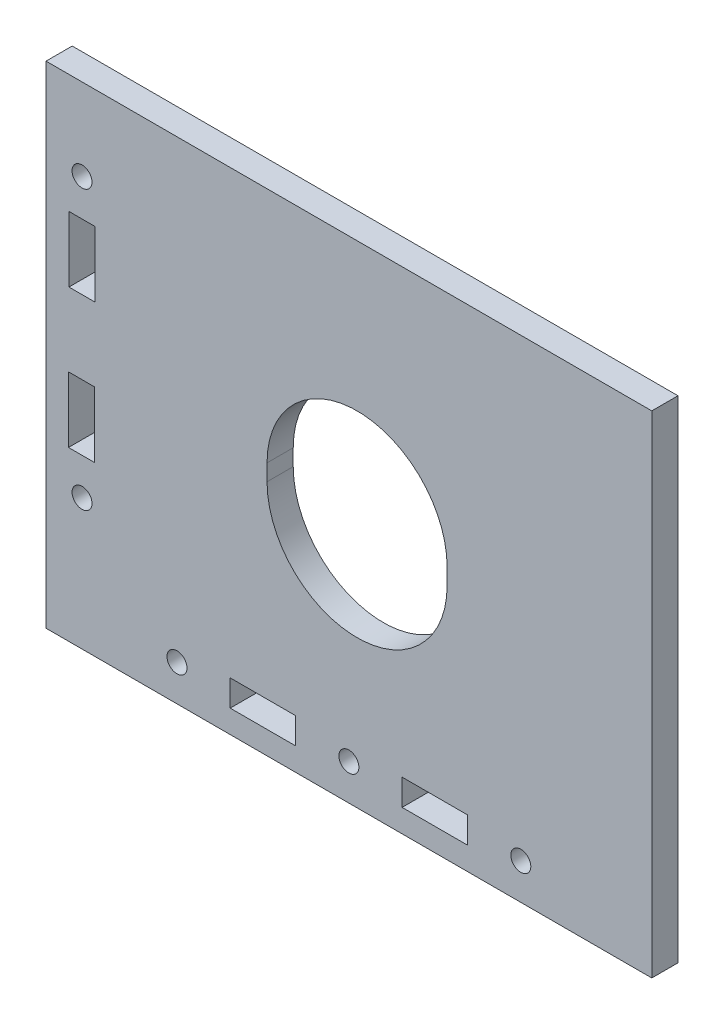
ISO-10303-21;
HEADER;
FILE_DESCRIPTION(('STEP AP214'),'2;1');
FILE_NAME('part.step','',(''),(''),'','','');
FILE_SCHEMA(('AUTOMOTIVE_DESIGN { 1 0 10303 214 1 1 1 1 }'));
ENDSEC;
DATA;
#1=APPLICATION_CONTEXT('core data for automotive mechanical design processes');
#2=APPLICATION_PROTOCOL_DEFINITION('international standard','automotive_design',2000,#1);
#3=PRODUCT_CONTEXT('',#1,'mechanical');
#4=PRODUCT('Part','Part','',(#3));
#5=PRODUCT_RELATED_PRODUCT_CATEGORY('part','',(#4));
#6=PRODUCT_DEFINITION_FORMATION('','',#4);
#7=PRODUCT_DEFINITION_CONTEXT('part definition',#1,'design');
#8=PRODUCT_DEFINITION('design','',#6,#7);
#9=PRODUCT_DEFINITION_SHAPE('','',#8);
#10=(LENGTH_UNIT() NAMED_UNIT(*) SI_UNIT(.MILLI.,.METRE.));
#11=(NAMED_UNIT(*) PLANE_ANGLE_UNIT() SI_UNIT($,.RADIAN.));
#12=(NAMED_UNIT(*) SI_UNIT($,.STERADIAN.) SOLID_ANGLE_UNIT());
#13=UNCERTAINTY_MEASURE_WITH_UNIT(LENGTH_MEASURE(1.E-05),#10,'distance_accuracy_value','');
#14=(GEOMETRIC_REPRESENTATION_CONTEXT(3) GLOBAL_UNCERTAINTY_ASSIGNED_CONTEXT((#13)) GLOBAL_UNIT_ASSIGNED_CONTEXT((#10,
#11,#12)) REPRESENTATION_CONTEXT('',''));
#15=CARTESIAN_POINT('',(0.,0.,0.));
#16=DIRECTION('',(0.,0.,1.));
#17=DIRECTION('',(1.,0.,0.));
#18=AXIS2_PLACEMENT_3D('',#15,#16,#17);
#19=CARTESIAN_POINT('',(0.,0.,8.));
#20=DIRECTION('',(0.,0.,-1.));
#21=DIRECTION('',(-1.,0.,0.));
#22=AXIS2_PLACEMENT_3D('',#19,#20,#21);
#23=PLANE('',#22);
#24=DIRECTION('',(1.,0.,0.));
#25=VECTOR('',#24,1.);
#26=CARTESIAN_POINT('',(0.,78.75,8.));
#27=LINE('',#26,#25);
#28=CARTESIAN_POINT('',(-8.,78.75,8.));
#29=VERTEX_POINT('',#28);
#30=CARTESIAN_POINT('',(0.,78.75,8.));
#31=VERTEX_POINT('',#30);
#32=EDGE_CURVE('E230',#29,#31,#27,.T.);
#33=ORIENTED_EDGE('',*,*,#32,.F.);
#34=DIRECTION('',(0.,-1.,0.));
#35=VECTOR('',#34,1.);
#36=CARTESIAN_POINT('',(-8.,78.75,8.));
#37=LINE('',#36,#35);
#38=CARTESIAN_POINT('',(-8.,98.75,8.));
#39=VERTEX_POINT('',#38);
#40=EDGE_CURVE('E238',#39,#29,#37,.T.);
#41=ORIENTED_EDGE('',*,*,#40,.F.);
#42=DIRECTION('',(-1.,0.,0.));
#43=VECTOR('',#42,1.);
#44=CARTESIAN_POINT('',(-8.,98.75,8.));
#45=LINE('',#44,#43);
#46=CARTESIAN_POINT('',(0.,98.75,8.));
#47=VERTEX_POINT('',#46);
#48=EDGE_CURVE('E235',#47,#39,#45,.T.);
#49=ORIENTED_EDGE('',*,*,#48,.F.);
#50=DIRECTION('',(0.,1.,0.));
#51=VECTOR('',#50,1.);
#52=CARTESIAN_POINT('',(0.,98.75,8.));
#53=LINE('',#52,#51);
#54=EDGE_CURVE('E232',#31,#47,#53,.T.);
#55=ORIENTED_EDGE('',*,*,#54,.F.);
#56=EDGE_LOOP('',(#33,#41,#49,#55));
#57=FACE_BOUND('',#56,.T.);
#58=DIRECTION('',(1.,0.,0.));
#59=VECTOR('',#58,1.);
#60=CARTESIAN_POINT('',(113.75,-8.,8.));
#61=LINE('',#60,#59);
#62=CARTESIAN_POINT('',(93.75,-8.,8.));
#63=VERTEX_POINT('',#62);
#64=CARTESIAN_POINT('',(113.75,-8.,8.));
#65=VERTEX_POINT('',#64);
#66=EDGE_CURVE('E292',#63,#65,#61,.T.);
#67=ORIENTED_EDGE('',*,*,#66,.F.);
#68=DIRECTION('',(0.,-1.,0.));
#69=VECTOR('',#68,1.);
#70=CARTESIAN_POINT('',(93.75,-8.,8.));
#71=LINE('',#70,#69);
#72=CARTESIAN_POINT('',(93.75,0.,8.));
#73=VERTEX_POINT('',#72);
#74=EDGE_CURVE('E300',#73,#63,#71,.T.);
#75=ORIENTED_EDGE('',*,*,#74,.F.);
#76=DIRECTION('',(-1.,0.,0.));
#77=VECTOR('',#76,1.);
#78=CARTESIAN_POINT('',(93.75,0.,8.));
#79=LINE('',#78,#77);
#80=CARTESIAN_POINT('',(113.75,0.,8.));
#81=VERTEX_POINT('',#80);
#82=EDGE_CURVE('E297',#81,#73,#79,.T.);
#83=ORIENTED_EDGE('',*,*,#82,.F.);
#84=DIRECTION('',(0.,1.,0.));
#85=VECTOR('',#84,1.);
#86=CARTESIAN_POINT('',(113.75,0.,8.));
#87=LINE('',#86,#85);
#88=EDGE_CURVE('E294',#65,#81,#87,.T.);
#89=ORIENTED_EDGE('',*,*,#88,.F.);
#90=EDGE_LOOP('',(#67,#75,#83,#89));
#91=FACE_BOUND('',#90,.T.);
#92=CARTESIAN_POINT('',(-4.,110.,8.));
#93=DIRECTION('',(0.,0.,1.));
#94=DIRECTION('',(1.,0.,0.));
#95=AXIS2_PLACEMENT_3D('',#92,#93,#94);
#96=CIRCLE('',#95,3.05);
#97=CARTESIAN_POINT('',(-0.95,110.,8.));
#98=VERTEX_POINT('',#97);
#99=EDGE_CURVE('E329',#98,#98,#96,.T.);
#100=ORIENTED_EDGE('',*,*,#99,.F.);
#101=EDGE_LOOP('',(#100));
#102=FACE_BOUND('',#101,.T.);
#103=CARTESIAN_POINT('',(25.,-4.,8.));
#104=DIRECTION('',(0.,0.,1.));
#105=DIRECTION('',(1.,0.,0.));
#106=AXIS2_PLACEMENT_3D('',#103,#104,#105);
#107=CIRCLE('',#106,3.05);
#108=CARTESIAN_POINT('',(28.05,-4.,8.));
#109=VERTEX_POINT('',#108);
#110=EDGE_CURVE('E341',#109,#109,#107,.T.);
#111=ORIENTED_EDGE('',*,*,#110,.F.);
#112=EDGE_LOOP('',(#111));
#113=FACE_BOUND('',#112,.T.);
#114=CARTESIAN_POINT('',(80.,62.5,8.));
#115=DIRECTION('',(0.,0.,1.));
#116=DIRECTION('',(1.,0.,0.));
#117=AXIS2_PLACEMENT_3D('',#114,#115,#116);
#118=CIRCLE('',#117,27.5);
#119=CARTESIAN_POINT('',(107.5,62.5,8.));
#120=VERTEX_POINT('',#119);
#121=CARTESIAN_POINT('',(52.5,62.5,8.));
#122=VERTEX_POINT('',#121);
#123=EDGE_CURVE('E353',#120,#122,#118,.T.);
#124=ORIENTED_EDGE('',*,*,#123,.F.);
#125=DIRECTION('',(0.,1.,0.));
#126=VECTOR('',#125,1.);
#127=CARTESIAN_POINT('',(107.5,62.5,8.));
#128=LINE('',#127,#126);
#129=CARTESIAN_POINT('',(107.5,57.5,8.));
#130=VERTEX_POINT('',#129);
#131=EDGE_CURVE('E361',#130,#120,#128,.T.);
#132=ORIENTED_EDGE('',*,*,#131,.F.);
#133=CARTESIAN_POINT('',(80.,57.5,8.));
#134=DIRECTION('',(0.,0.,1.));
#135=DIRECTION('',(1.,0.,0.));
#136=AXIS2_PLACEMENT_3D('',#133,#134,#135);
#137=CIRCLE('',#136,27.5);
#138=CARTESIAN_POINT('',(52.5,57.5,8.));
#139=VERTEX_POINT('',#138);
#140=EDGE_CURVE('E358',#139,#130,#137,.T.);
#141=ORIENTED_EDGE('',*,*,#140,.F.);
#142=DIRECTION('',(0.,-1.,0.));
#143=VECTOR('',#142,1.);
#144=CARTESIAN_POINT('',(52.5,57.5,8.));
#145=LINE('',#144,#143);
#146=EDGE_CURVE('E355',#122,#139,#145,.T.);
#147=ORIENTED_EDGE('',*,*,#146,.F.);
#148=EDGE_LOOP('',(#124,#132,#141,#147));
#149=FACE_BOUND('',#148,.T.);
#150=DIRECTION('',(1.,0.,0.));
#151=VECTOR('',#150,1.);
#152=CARTESIAN_POINT('',(170.,-15.,8.));
#153=LINE('',#152,#151);
#154=CARTESIAN_POINT('',(-15.,-15.,8.));
#155=VERTEX_POINT('',#154);
#156=CARTESIAN_POINT('',(170.,-15.,8.));
#157=VERTEX_POINT('',#156);
#158=EDGE_CURVE('E384',#155,#157,#153,.T.);
#159=ORIENTED_EDGE('',*,*,#158,.T.);
#160=DIRECTION('',(0.,1.,0.));
#161=VECTOR('',#160,1.);
#162=CARTESIAN_POINT('',(170.,-15.,8.));
#163=LINE('',#162,#161);
#164=CARTESIAN_POINT('',(170.,135.,8.));
#165=VERTEX_POINT('',#164);
#166=EDGE_CURVE('E387',#157,#165,#163,.T.);
#167=ORIENTED_EDGE('',*,*,#166,.T.);
#168=DIRECTION('',(-1.,0.,0.));
#169=VECTOR('',#168,1.);
#170=CARTESIAN_POINT('',(170.,135.,8.));
#171=LINE('',#170,#169);
#172=CARTESIAN_POINT('',(-15.,135.,8.));
#173=VERTEX_POINT('',#172);
#174=EDGE_CURVE('E390',#165,#173,#171,.T.);
#175=ORIENTED_EDGE('',*,*,#174,.T.);
#176=DIRECTION('',(0.,-1.,0.));
#177=VECTOR('',#176,1.);
#178=CARTESIAN_POINT('',(-15.,-15.,8.));
#179=LINE('',#178,#177);
#180=EDGE_CURVE('E392',#173,#155,#179,.T.);
#181=ORIENTED_EDGE('',*,*,#180,.T.);
#182=EDGE_LOOP('',(#159,#167,#175,#181));
#183=FACE_BOUND('',#182,.T.);
#184=CARTESIAN_POINT('',(130.,-4.,8.));
#185=DIRECTION('',(0.,0.,1.));
#186=DIRECTION('',(1.,0.,0.));
#187=AXIS2_PLACEMENT_3D('',#184,#185,#186);
#188=CIRCLE('',#187,3.05);
#189=CARTESIAN_POINT('',(133.05,-4.,8.));
#190=VERTEX_POINT('',#189);
#191=EDGE_CURVE('E347',#190,#190,#188,.T.);
#192=ORIENTED_EDGE('',*,*,#191,.F.);
#193=EDGE_LOOP('',(#192));
#194=FACE_BOUND('',#193,.T.);
#195=CARTESIAN_POINT('',(-4.,25.,8.));
#196=DIRECTION('',(0.,0.,1.));
#197=DIRECTION('',(1.,0.,0.));
#198=AXIS2_PLACEMENT_3D('',#195,#196,#197);
#199=CIRCLE('',#198,3.05);
#200=CARTESIAN_POINT('',(-0.95,25.,8.));
#201=VERTEX_POINT('',#200);
#202=EDGE_CURVE('E335',#201,#201,#199,.T.);
#203=ORIENTED_EDGE('',*,*,#202,.F.);
#204=EDGE_LOOP('',(#203));
#205=FACE_BOUND('',#204,.T.);
#206=CARTESIAN_POINT('',(77.5,-4.,8.));
#207=DIRECTION('',(0.,0.,1.));
#208=DIRECTION('',(1.,0.,0.));
#209=AXIS2_PLACEMENT_3D('',#206,#207,#208);
#210=CIRCLE('',#209,3.05000000000001);
#211=CARTESIAN_POINT('',(80.55,-4.,8.));
#212=VERTEX_POINT('',#211);
#213=EDGE_CURVE('E323',#212,#212,#210,.T.);
#214=ORIENTED_EDGE('',*,*,#213,.F.);
#215=EDGE_LOOP('',(#214));
#216=FACE_BOUND('',#215,.T.);
#217=DIRECTION('',(1.,0.,0.));
#218=VECTOR('',#217,1.);
#219=CARTESIAN_POINT('',(61.25,-8.,8.));
#220=LINE('',#219,#218);
#221=CARTESIAN_POINT('',(41.25,-8.,8.));
#222=VERTEX_POINT('',#221);
#223=CARTESIAN_POINT('',(61.25,-8.,8.));
#224=VERTEX_POINT('',#223);
#225=EDGE_CURVE('E261',#222,#224,#220,.T.);
#226=ORIENTED_EDGE('',*,*,#225,.F.);
#227=DIRECTION('',(0.,-1.,0.));
#228=VECTOR('',#227,1.);
#229=CARTESIAN_POINT('',(41.25,-8.,8.));
#230=LINE('',#229,#228);
#231=CARTESIAN_POINT('',(41.25,0.,8.));
#232=VERTEX_POINT('',#231);
#233=EDGE_CURVE('E269',#232,#222,#230,.T.);
#234=ORIENTED_EDGE('',*,*,#233,.F.);
#235=DIRECTION('',(-1.,0.,0.));
#236=VECTOR('',#235,1.);
#237=CARTESIAN_POINT('',(41.25,0.,8.));
#238=LINE('',#237,#236);
#239=CARTESIAN_POINT('',(61.25,0.,8.));
#240=VERTEX_POINT('',#239);
#241=EDGE_CURVE('E266',#240,#232,#238,.T.);
#242=ORIENTED_EDGE('',*,*,#241,.F.);
#243=DIRECTION('',(0.,1.,0.));
#244=VECTOR('',#243,1.);
#245=CARTESIAN_POINT('',(61.25,0.,8.));
#246=LINE('',#245,#244);
#247=EDGE_CURVE('E263',#224,#240,#246,.T.);
#248=ORIENTED_EDGE('',*,*,#247,.F.);
#249=EDGE_LOOP('',(#226,#234,#242,#248));
#250=FACE_BOUND('',#249,.T.);
#251=DIRECTION('',(1.,0.,0.));
#252=VECTOR('',#251,1.);
#253=CARTESIAN_POINT('',(-0.13466,36.25,8.));
#254=LINE('',#253,#252);
#255=CARTESIAN_POINT('',(-8.13466,36.25,8.));
#256=VERTEX_POINT('',#255);
#257=CARTESIAN_POINT('',(-0.13466,36.25,8.));
#258=VERTEX_POINT('',#257);
#259=EDGE_CURVE('E194',#256,#258,#254,.T.);
#260=ORIENTED_EDGE('',*,*,#259,.F.);
#261=DIRECTION('',(0.,-1.,0.));
#262=VECTOR('',#261,1.);
#263=CARTESIAN_POINT('',(-8.13466,36.25,8.));
#264=LINE('',#263,#262);
#265=CARTESIAN_POINT('',(-8.13466,56.25,8.));
#266=VERTEX_POINT('',#265);
#267=EDGE_CURVE('E216',#266,#256,#264,.T.);
#268=ORIENTED_EDGE('',*,*,#267,.F.);
#269=DIRECTION('',(-1.,0.,0.));
#270=VECTOR('',#269,1.);
#271=CARTESIAN_POINT('',(-8.13466,56.25,8.));
#272=LINE('',#271,#270);
#273=CARTESIAN_POINT('',(-0.13466,56.25,8.));
#274=VERTEX_POINT('',#273);
#275=EDGE_CURVE('E214',#274,#266,#272,.T.);
#276=ORIENTED_EDGE('',*,*,#275,.F.);
#277=DIRECTION('',(0.,1.,0.));
#278=VECTOR('',#277,1.);
#279=CARTESIAN_POINT('',(-0.13466,56.25,8.));
#280=LINE('',#279,#278);
#281=EDGE_CURVE('E202',#258,#274,#280,.T.);
#282=ORIENTED_EDGE('',*,*,#281,.F.);
#283=EDGE_LOOP('',(#260,#268,#276,#282));
#284=FACE_BOUND('',#283,.T.);
#285=ADVANCED_FACE('F33',(#57,#91,#102,#113,#149,#183,#194,#205,#216,#250,#284),#23,.F.);
#286=CARTESIAN_POINT('',(0.,0.,0.));
#287=DIRECTION('',(0.,0.,-1.));
#288=DIRECTION('',(-1.,0.,0.));
#289=AXIS2_PLACEMENT_3D('',#286,#287,#288);
#290=PLANE('',#289);
#291=DIRECTION('',(0.,-1.,0.));
#292=VECTOR('',#291,1.);
#293=CARTESIAN_POINT('',(-8.,78.75,0.));
#294=LINE('',#293,#292);
#295=CARTESIAN_POINT('',(-8.,98.75,0.));
#296=VERTEX_POINT('',#295);
#297=CARTESIAN_POINT('',(-8.,78.75,0.));
#298=VERTEX_POINT('',#297);
#299=EDGE_CURVE('E233',#296,#298,#294,.T.);
#300=ORIENTED_EDGE('',*,*,#299,.T.);
#301=DIRECTION('',(1.,0.,0.));
#302=VECTOR('',#301,1.);
#303=CARTESIAN_POINT('',(0.,78.75,0.));
#304=LINE('',#303,#302);
#305=CARTESIAN_POINT('',(0.,78.75,0.));
#306=VERTEX_POINT('',#305);
#307=EDGE_CURVE('E210',#298,#306,#304,.T.);
#308=ORIENTED_EDGE('',*,*,#307,.T.);
#309=DIRECTION('',(0.,1.,0.));
#310=VECTOR('',#309,1.);
#311=CARTESIAN_POINT('',(0.,98.75,0.));
#312=LINE('',#311,#310);
#313=CARTESIAN_POINT('',(0.,98.75,0.));
#314=VERTEX_POINT('',#313);
#315=EDGE_CURVE('E243',#306,#314,#312,.T.);
#316=ORIENTED_EDGE('',*,*,#315,.T.);
#317=DIRECTION('',(-1.,0.,0.));
#318=VECTOR('',#317,1.);
#319=CARTESIAN_POINT('',(-8.,98.75,0.));
#320=LINE('',#319,#318);
#321=EDGE_CURVE('E246',#314,#296,#320,.T.);
#322=ORIENTED_EDGE('',*,*,#321,.T.);
#323=EDGE_LOOP('',(#300,#308,#316,#322));
#324=FACE_BOUND('',#323,.T.);
#325=DIRECTION('',(0.,-1.,0.));
#326=VECTOR('',#325,1.);
#327=CARTESIAN_POINT('',(93.75,-8.,0.));
#328=LINE('',#327,#326);
#329=CARTESIAN_POINT('',(93.75,0.,0.));
#330=VERTEX_POINT('',#329);
#331=CARTESIAN_POINT('',(93.75,-8.,0.));
#332=VERTEX_POINT('',#331);
#333=EDGE_CURVE('E295',#330,#332,#328,.T.);
#334=ORIENTED_EDGE('',*,*,#333,.T.);
#335=DIRECTION('',(1.,0.,0.));
#336=VECTOR('',#335,1.);
#337=CARTESIAN_POINT('',(113.75,-8.,0.));
#338=LINE('',#337,#336);
#339=CARTESIAN_POINT('',(113.75,-8.,0.));
#340=VERTEX_POINT('',#339);
#341=EDGE_CURVE('E291',#332,#340,#338,.T.);
#342=ORIENTED_EDGE('',*,*,#341,.T.);
#343=DIRECTION('',(0.,1.,0.));
#344=VECTOR('',#343,1.);
#345=CARTESIAN_POINT('',(113.75,0.,0.));
#346=LINE('',#345,#344);
#347=CARTESIAN_POINT('',(113.75,0.,0.));
#348=VERTEX_POINT('',#347);
#349=EDGE_CURVE('E305',#340,#348,#346,.T.);
#350=ORIENTED_EDGE('',*,*,#349,.T.);
#351=DIRECTION('',(-1.,0.,0.));
#352=VECTOR('',#351,1.);
#353=CARTESIAN_POINT('',(93.75,0.,0.));
#354=LINE('',#353,#352);
#355=EDGE_CURVE('E308',#348,#330,#354,.T.);
#356=ORIENTED_EDGE('',*,*,#355,.T.);
#357=EDGE_LOOP('',(#334,#342,#350,#356));
#358=FACE_BOUND('',#357,.T.);
#359=CARTESIAN_POINT('',(-4.,110.,0.));
#360=DIRECTION('',(0.,0.,1.));
#361=DIRECTION('',(1.,0.,0.));
#362=AXIS2_PLACEMENT_3D('',#359,#360,#361);
#363=CIRCLE('',#362,3.05);
#364=CARTESIAN_POINT('',(-0.95,110.,0.));
#365=VERTEX_POINT('',#364);
#366=EDGE_CURVE('E326',#365,#365,#363,.T.);
#367=ORIENTED_EDGE('',*,*,#366,.T.);
#368=EDGE_LOOP('',(#367));
#369=FACE_BOUND('',#368,.T.);
#370=CARTESIAN_POINT('',(25.,-4.,0.));
#371=DIRECTION('',(0.,0.,1.));
#372=DIRECTION('',(1.,0.,0.));
#373=AXIS2_PLACEMENT_3D('',#370,#371,#372);
#374=CIRCLE('',#373,3.05);
#375=CARTESIAN_POINT('',(28.05,-4.,0.));
#376=VERTEX_POINT('',#375);
#377=EDGE_CURVE('E338',#376,#376,#374,.T.);
#378=ORIENTED_EDGE('',*,*,#377,.T.);
#379=EDGE_LOOP('',(#378));
#380=FACE_BOUND('',#379,.T.);
#381=DIRECTION('',(0.,1.,0.));
#382=VECTOR('',#381,1.);
#383=CARTESIAN_POINT('',(107.5,62.5,0.));
#384=LINE('',#383,#382);
#385=CARTESIAN_POINT('',(107.5,57.5,0.));
#386=VERTEX_POINT('',#385);
#387=CARTESIAN_POINT('',(107.5,62.5,0.));
#388=VERTEX_POINT('',#387);
#389=EDGE_CURVE('E356',#386,#388,#384,.T.);
#390=ORIENTED_EDGE('',*,*,#389,.T.);
#391=CARTESIAN_POINT('',(80.,62.5,0.));
#392=DIRECTION('',(0.,0.,1.));
#393=DIRECTION('',(1.,0.,0.));
#394=AXIS2_PLACEMENT_3D('',#391,#392,#393);
#395=CIRCLE('',#394,27.5);
#396=CARTESIAN_POINT('',(52.5,62.5,0.));
#397=VERTEX_POINT('',#396);
#398=EDGE_CURVE('E350',#388,#397,#395,.T.);
#399=ORIENTED_EDGE('',*,*,#398,.T.);
#400=DIRECTION('',(0.,-1.,0.));
#401=VECTOR('',#400,1.);
#402=CARTESIAN_POINT('',(52.5,57.5,0.));
#403=LINE('',#402,#401);
#404=CARTESIAN_POINT('',(52.5,57.5,0.));
#405=VERTEX_POINT('',#404);
#406=EDGE_CURVE('E366',#397,#405,#403,.T.);
#407=ORIENTED_EDGE('',*,*,#406,.T.);
#408=CARTESIAN_POINT('',(80.,57.5,0.));
#409=DIRECTION('',(0.,0.,1.));
#410=DIRECTION('',(1.,0.,0.));
#411=AXIS2_PLACEMENT_3D('',#408,#409,#410);
#412=CIRCLE('',#411,27.5);
#413=EDGE_CURVE('E369',#405,#386,#412,.T.);
#414=ORIENTED_EDGE('',*,*,#413,.T.);
#415=EDGE_LOOP('',(#390,#399,#407,#414));
#416=FACE_BOUND('',#415,.T.);
#417=DIRECTION('',(1.,0.,0.));
#418=VECTOR('',#417,1.);
#419=CARTESIAN_POINT('',(170.,-15.,0.));
#420=LINE('',#419,#418);
#421=CARTESIAN_POINT('',(-15.,-15.,0.));
#422=VERTEX_POINT('',#421);
#423=CARTESIAN_POINT('',(170.,-15.,0.));
#424=VERTEX_POINT('',#423);
#425=EDGE_CURVE('E383',#422,#424,#420,.T.);
#426=ORIENTED_EDGE('',*,*,#425,.F.);
#427=DIRECTION('',(0.,-1.,0.));
#428=VECTOR('',#427,1.);
#429=CARTESIAN_POINT('',(-15.,-15.,0.));
#430=LINE('',#429,#428);
#431=CARTESIAN_POINT('',(-15.,135.,0.));
#432=VERTEX_POINT('',#431);
#433=EDGE_CURVE('E388',#432,#422,#430,.T.);
#434=ORIENTED_EDGE('',*,*,#433,.F.);
#435=DIRECTION('',(-1.,0.,0.));
#436=VECTOR('',#435,1.);
#437=CARTESIAN_POINT('',(170.,135.,0.));
#438=LINE('',#437,#436);
#439=CARTESIAN_POINT('',(170.,135.,0.));
#440=VERTEX_POINT('',#439);
#441=EDGE_CURVE('E399',#440,#432,#438,.T.);
#442=ORIENTED_EDGE('',*,*,#441,.F.);
#443=DIRECTION('',(0.,1.,0.));
#444=VECTOR('',#443,1.);
#445=CARTESIAN_POINT('',(170.,-15.,0.));
#446=LINE('',#445,#444);
#447=EDGE_CURVE('E397',#424,#440,#446,.T.);
#448=ORIENTED_EDGE('',*,*,#447,.F.);
#449=EDGE_LOOP('',(#426,#434,#442,#448));
#450=FACE_BOUND('',#449,.T.);
#451=CARTESIAN_POINT('',(130.,-4.,0.));
#452=DIRECTION('',(0.,0.,1.));
#453=DIRECTION('',(1.,0.,0.));
#454=AXIS2_PLACEMENT_3D('',#451,#452,#453);
#455=CIRCLE('',#454,3.05);
#456=CARTESIAN_POINT('',(133.05,-4.,0.));
#457=VERTEX_POINT('',#456);
#458=EDGE_CURVE('E344',#457,#457,#455,.T.);
#459=ORIENTED_EDGE('',*,*,#458,.T.);
#460=EDGE_LOOP('',(#459));
#461=FACE_BOUND('',#460,.T.);
#462=CARTESIAN_POINT('',(-4.,25.,0.));
#463=DIRECTION('',(0.,0.,1.));
#464=DIRECTION('',(1.,0.,0.));
#465=AXIS2_PLACEMENT_3D('',#462,#463,#464);
#466=CIRCLE('',#465,3.05);
#467=CARTESIAN_POINT('',(-0.95,25.,0.));
#468=VERTEX_POINT('',#467);
#469=EDGE_CURVE('E332',#468,#468,#466,.T.);
#470=ORIENTED_EDGE('',*,*,#469,.T.);
#471=EDGE_LOOP('',(#470));
#472=FACE_BOUND('',#471,.T.);
#473=CARTESIAN_POINT('',(77.5,-4.,0.));
#474=DIRECTION('',(0.,0.,1.));
#475=DIRECTION('',(1.,0.,0.));
#476=AXIS2_PLACEMENT_3D('',#473,#474,#475);
#477=CIRCLE('',#476,3.05000000000001);
#478=CARTESIAN_POINT('',(80.55,-4.,0.));
#479=VERTEX_POINT('',#478);
#480=EDGE_CURVE('E322',#479,#479,#477,.T.);
#481=ORIENTED_EDGE('',*,*,#480,.T.);
#482=EDGE_LOOP('',(#481));
#483=FACE_BOUND('',#482,.T.);
#484=DIRECTION('',(0.,-1.,0.));
#485=VECTOR('',#484,1.);
#486=CARTESIAN_POINT('',(41.25,-8.,0.));
#487=LINE('',#486,#485);
#488=CARTESIAN_POINT('',(41.25,0.,0.));
#489=VERTEX_POINT('',#488);
#490=CARTESIAN_POINT('',(41.25,-8.,0.));
#491=VERTEX_POINT('',#490);
#492=EDGE_CURVE('E264',#489,#491,#487,.T.);
#493=ORIENTED_EDGE('',*,*,#492,.T.);
#494=DIRECTION('',(1.,0.,0.));
#495=VECTOR('',#494,1.);
#496=CARTESIAN_POINT('',(61.25,-8.,0.));
#497=LINE('',#496,#495);
#498=CARTESIAN_POINT('',(61.25,-8.,0.));
#499=VERTEX_POINT('',#498);
#500=EDGE_CURVE('E260',#491,#499,#497,.T.);
#501=ORIENTED_EDGE('',*,*,#500,.T.);
#502=DIRECTION('',(0.,1.,0.));
#503=VECTOR('',#502,1.);
#504=CARTESIAN_POINT('',(61.25,0.,0.));
#505=LINE('',#504,#503);
#506=CARTESIAN_POINT('',(61.25,0.,0.));
#507=VERTEX_POINT('',#506);
#508=EDGE_CURVE('E274',#499,#507,#505,.T.);
#509=ORIENTED_EDGE('',*,*,#508,.T.);
#510=DIRECTION('',(-1.,0.,0.));
#511=VECTOR('',#510,1.);
#512=CARTESIAN_POINT('',(41.25,0.,0.));
#513=LINE('',#512,#511);
#514=EDGE_CURVE('E277',#507,#489,#513,.T.);
#515=ORIENTED_EDGE('',*,*,#514,.T.);
#516=EDGE_LOOP('',(#493,#501,#509,#515));
#517=FACE_BOUND('',#516,.T.);
#518=DIRECTION('',(0.,-1.,0.));
#519=VECTOR('',#518,1.);
#520=CARTESIAN_POINT('',(-8.13466,36.25,0.));
#521=LINE('',#520,#519);
#522=CARTESIAN_POINT('',(-8.13466,56.25,0.));
#523=VERTEX_POINT('',#522);
#524=CARTESIAN_POINT('',(-8.13466,36.25,0.));
#525=VERTEX_POINT('',#524);
#526=EDGE_CURVE('E203',#523,#525,#521,.T.);
#527=ORIENTED_EDGE('',*,*,#526,.T.);
#528=DIRECTION('',(1.,0.,0.));
#529=VECTOR('',#528,1.);
#530=CARTESIAN_POINT('',(-0.13466,36.25,0.));
#531=LINE('',#530,#529);
#532=CARTESIAN_POINT('',(-0.13466,36.25,0.));
#533=VERTEX_POINT('',#532);
#534=EDGE_CURVE('E56',#525,#533,#531,.T.);
#535=ORIENTED_EDGE('',*,*,#534,.T.);
#536=DIRECTION('',(0.,1.,0.));
#537=VECTOR('',#536,1.);
#538=CARTESIAN_POINT('',(-0.13466,56.25,0.));
#539=LINE('',#538,#537);
#540=CARTESIAN_POINT('',(-0.13466,56.25,0.));
#541=VERTEX_POINT('',#540);
#542=EDGE_CURVE('E209',#533,#541,#539,.T.);
#543=ORIENTED_EDGE('',*,*,#542,.T.);
#544=DIRECTION('',(-1.,0.,0.));
#545=VECTOR('',#544,1.);
#546=CARTESIAN_POINT('',(-8.13466,56.25,0.));
#547=LINE('',#546,#545);
#548=EDGE_CURVE('E222',#541,#523,#547,.T.);
#549=ORIENTED_EDGE('',*,*,#548,.T.);
#550=EDGE_LOOP('',(#527,#535,#543,#549));
#551=FACE_BOUND('',#550,.T.);
#552=ADVANCED_FACE('F417',(#324,#358,#369,#380,#416,#450,#461,#472,#483,#517,#551),#290,.T.);
#553=CARTESIAN_POINT('',(170.,-15.,8.));
#554=DIRECTION('',(0.,1.,0.));
#555=DIRECTION('',(-1.,0.,0.));
#556=AXIS2_PLACEMENT_3D('',#553,#554,#555);
#557=PLANE('',#556);
#558=ORIENTED_EDGE('',*,*,#425,.T.);
#559=DIRECTION('',(0.,0.,-1.));
#560=VECTOR('',#559,1.);
#561=CARTESIAN_POINT('',(170.,-15.,8.));
#562=LINE('',#561,#560);
#563=EDGE_CURVE('E11',#157,#424,#562,.T.);
#564=ORIENTED_EDGE('',*,*,#563,.F.);
#565=ORIENTED_EDGE('',*,*,#158,.F.);
#566=DIRECTION('',(0.,0.,-1.));
#567=VECTOR('',#566,1.);
#568=CARTESIAN_POINT('',(-15.,-15.,8.));
#569=LINE('',#568,#567);
#570=EDGE_CURVE('E394',#155,#422,#569,.T.);
#571=ORIENTED_EDGE('',*,*,#570,.T.);
#572=EDGE_LOOP('',(#558,#564,#565,#571));
#573=FACE_BOUND('',#572,.T.);
#574=ADVANCED_FACE('F35',(#573),#557,.F.);
#575=CARTESIAN_POINT('',(170.,-15.,8.));
#576=DIRECTION('',(-1.,0.,0.));
#577=DIRECTION('',(0.,0.,1.));
#578=AXIS2_PLACEMENT_3D('',#575,#576,#577);
#579=PLANE('',#578);
#580=ORIENTED_EDGE('',*,*,#447,.T.);
#581=DIRECTION('',(0.,0.,-1.));
#582=VECTOR('',#581,1.);
#583=CARTESIAN_POINT('',(170.,135.,8.));
#584=LINE('',#583,#582);
#585=EDGE_CURVE('E41',#165,#440,#584,.T.);
#586=ORIENTED_EDGE('',*,*,#585,.F.);
#587=ORIENTED_EDGE('',*,*,#166,.F.);
#588=ORIENTED_EDGE('',*,*,#563,.T.);
#589=EDGE_LOOP('',(#580,#586,#587,#588));
#590=FACE_BOUND('',#589,.T.);
#591=ADVANCED_FACE('F428',(#590),#579,.F.);
#592=CARTESIAN_POINT('',(170.,135.,8.));
#593=DIRECTION('',(0.,-1.,0.));
#594=DIRECTION('',(1.,0.,0.));
#595=AXIS2_PLACEMENT_3D('',#592,#593,#594);
#596=PLANE('',#595);
#597=ORIENTED_EDGE('',*,*,#441,.T.);
#598=DIRECTION('',(0.,0.,-1.));
#599=VECTOR('',#598,1.);
#600=CARTESIAN_POINT('',(-15.,135.,8.));
#601=LINE('',#600,#599);
#602=EDGE_CURVE('E404',#173,#432,#601,.T.);
#603=ORIENTED_EDGE('',*,*,#602,.F.);
#604=ORIENTED_EDGE('',*,*,#174,.F.);
#605=ORIENTED_EDGE('',*,*,#585,.T.);
#606=EDGE_LOOP('',(#597,#603,#604,#605));
#607=FACE_BOUND('',#606,.T.);
#608=ADVANCED_FACE('F411',(#607),#596,.F.);
#609=CARTESIAN_POINT('',(-15.,-15.,8.));
#610=DIRECTION('',(1.,0.,0.));
#611=DIRECTION('',(0.,0.,-1.));
#612=AXIS2_PLACEMENT_3D('',#609,#610,#611);
#613=PLANE('',#612);
#614=ORIENTED_EDGE('',*,*,#433,.T.);
#615=ORIENTED_EDGE('',*,*,#570,.F.);
#616=ORIENTED_EDGE('',*,*,#180,.F.);
#617=ORIENTED_EDGE('',*,*,#602,.T.);
#618=EDGE_LOOP('',(#614,#615,#616,#617));
#619=FACE_BOUND('',#618,.T.);
#620=ADVANCED_FACE('F421',(#619),#613,.F.);
#621=CARTESIAN_POINT('',(80.,62.5,8.));
#622=DIRECTION('',(0.,0.,-1.));
#623=DIRECTION('',(-1.,0.,0.));
#624=AXIS2_PLACEMENT_3D('',#621,#622,#623);
#625=CYLINDRICAL_SURFACE('',#624,27.5);
#626=ORIENTED_EDGE('',*,*,#398,.F.);
#627=DIRECTION('',(0.,0.,-1.));
#628=VECTOR('',#627,1.);
#629=CARTESIAN_POINT('',(107.5,62.5,8.));
#630=LINE('',#629,#628);
#631=EDGE_CURVE('E363',#120,#388,#630,.T.);
#632=ORIENTED_EDGE('',*,*,#631,.F.);
#633=ORIENTED_EDGE('',*,*,#123,.T.);
#634=DIRECTION('',(0.,0.,-1.));
#635=VECTOR('',#634,1.);
#636=CARTESIAN_POINT('',(52.5,62.5,8.));
#637=LINE('',#636,#635);
#638=EDGE_CURVE('E380',#122,#397,#637,.T.);
#639=ORIENTED_EDGE('',*,*,#638,.T.);
#640=EDGE_LOOP('',(#626,#632,#633,#639));
#641=FACE_BOUND('',#640,.T.);
#642=ADVANCED_FACE('F446',(#641),#625,.F.);
#643=CARTESIAN_POINT('',(52.5,57.5,8.));
#644=DIRECTION('',(1.,0.,0.));
#645=DIRECTION('',(0.,0.,-1.));
#646=AXIS2_PLACEMENT_3D('',#643,#644,#645);
#647=PLANE('',#646);
#648=ORIENTED_EDGE('',*,*,#406,.F.);
#649=ORIENTED_EDGE('',*,*,#638,.F.);
#650=ORIENTED_EDGE('',*,*,#146,.T.);
#651=DIRECTION('',(0.,0.,-1.));
#652=VECTOR('',#651,1.);
#653=CARTESIAN_POINT('',(52.5,57.5,8.));
#654=LINE('',#653,#652);
#655=EDGE_CURVE('E378',#139,#405,#654,.T.);
#656=ORIENTED_EDGE('',*,*,#655,.T.);
#657=EDGE_LOOP('',(#648,#649,#650,#656));
#658=FACE_BOUND('',#657,.T.);
#659=ADVANCED_FACE('F453',(#658),#647,.T.);
#660=CARTESIAN_POINT('',(80.,57.5,8.));
#661=DIRECTION('',(0.,0.,-1.));
#662=DIRECTION('',(-1.,0.,0.));
#663=AXIS2_PLACEMENT_3D('',#660,#661,#662);
#664=CYLINDRICAL_SURFACE('',#663,27.5);
#665=ORIENTED_EDGE('',*,*,#413,.F.);
#666=ORIENTED_EDGE('',*,*,#655,.F.);
#667=ORIENTED_EDGE('',*,*,#140,.T.);
#668=DIRECTION('',(0.,0.,-1.));
#669=VECTOR('',#668,1.);
#670=CARTESIAN_POINT('',(107.5,57.5,8.));
#671=LINE('',#670,#669);
#672=EDGE_CURVE('E376',#130,#386,#671,.T.);
#673=ORIENTED_EDGE('',*,*,#672,.T.);
#674=EDGE_LOOP('',(#665,#666,#667,#673));
#675=FACE_BOUND('',#674,.T.);
#676=ADVANCED_FACE('F458',(#675),#664,.F.);
#677=CARTESIAN_POINT('',(107.5,62.5,8.));
#678=DIRECTION('',(-1.,0.,0.));
#679=DIRECTION('',(0.,0.,1.));
#680=AXIS2_PLACEMENT_3D('',#677,#678,#679);
#681=PLANE('',#680);
#682=ORIENTED_EDGE('',*,*,#389,.F.);
#683=ORIENTED_EDGE('',*,*,#672,.F.);
#684=ORIENTED_EDGE('',*,*,#131,.T.);
#685=ORIENTED_EDGE('',*,*,#631,.T.);
#686=EDGE_LOOP('',(#682,#683,#684,#685));
#687=FACE_BOUND('',#686,.T.);
#688=ADVANCED_FACE('F466',(#687),#681,.T.);
#689=CARTESIAN_POINT('',(130.,-4.,8.));
#690=DIRECTION('',(0.,0.,-1.));
#691=DIRECTION('',(-1.,0.,0.));
#692=AXIS2_PLACEMENT_3D('',#689,#690,#691);
#693=CYLINDRICAL_SURFACE('',#692,3.05);
#694=ORIENTED_EDGE('',*,*,#191,.T.);
#695=EDGE_LOOP('',(#694));
#696=FACE_BOUND('',#695,.T.);
#697=ORIENTED_EDGE('',*,*,#458,.F.);
#698=EDGE_LOOP('',(#697));
#699=FACE_BOUND('',#698,.T.);
#700=ADVANCED_FACE('F479',(#696,#699),#693,.F.);
#701=CARTESIAN_POINT('',(25.,-4.,8.));
#702=DIRECTION('',(0.,0.,-1.));
#703=DIRECTION('',(-1.,0.,0.));
#704=AXIS2_PLACEMENT_3D('',#701,#702,#703);
#705=CYLINDRICAL_SURFACE('',#704,3.05);
#706=ORIENTED_EDGE('',*,*,#110,.T.);
#707=EDGE_LOOP('',(#706));
#708=FACE_BOUND('',#707,.T.);
#709=ORIENTED_EDGE('',*,*,#377,.F.);
#710=EDGE_LOOP('',(#709));
#711=FACE_BOUND('',#710,.T.);
#712=ADVANCED_FACE('F484',(#708,#711),#705,.F.);
#713=CARTESIAN_POINT('',(-4.,25.,8.));
#714=DIRECTION('',(0.,0.,-1.));
#715=DIRECTION('',(-1.,0.,0.));
#716=AXIS2_PLACEMENT_3D('',#713,#714,#715);
#717=CYLINDRICAL_SURFACE('',#716,3.05);
#718=ORIENTED_EDGE('',*,*,#202,.T.);
#719=EDGE_LOOP('',(#718));
#720=FACE_BOUND('',#719,.T.);
#721=ORIENTED_EDGE('',*,*,#469,.F.);
#722=EDGE_LOOP('',(#721));
#723=FACE_BOUND('',#722,.T.);
#724=ADVANCED_FACE('F488',(#720,#723),#717,.F.);
#725=CARTESIAN_POINT('',(-4.,110.,8.));
#726=DIRECTION('',(0.,0.,-1.));
#727=DIRECTION('',(-1.,0.,0.));
#728=AXIS2_PLACEMENT_3D('',#725,#726,#727);
#729=CYLINDRICAL_SURFACE('',#728,3.05);
#730=ORIENTED_EDGE('',*,*,#99,.T.);
#731=EDGE_LOOP('',(#730));
#732=FACE_BOUND('',#731,.T.);
#733=ORIENTED_EDGE('',*,*,#366,.F.);
#734=EDGE_LOOP('',(#733));
#735=FACE_BOUND('',#734,.T.);
#736=ADVANCED_FACE('F492',(#732,#735),#729,.F.);
#737=CARTESIAN_POINT('',(77.5,-4.,8.));
#738=DIRECTION('',(0.,0.,-1.));
#739=DIRECTION('',(-1.,0.,0.));
#740=AXIS2_PLACEMENT_3D('',#737,#738,#739);
#741=CYLINDRICAL_SURFACE('',#740,3.05000000000001);
#742=ORIENTED_EDGE('',*,*,#213,.T.);
#743=EDGE_LOOP('',(#742));
#744=FACE_BOUND('',#743,.T.);
#745=ORIENTED_EDGE('',*,*,#480,.F.);
#746=EDGE_LOOP('',(#745));
#747=FACE_BOUND('',#746,.T.);
#748=ADVANCED_FACE('F496',(#744,#747),#741,.F.);
#749=CARTESIAN_POINT('',(113.75,-8.,8.));
#750=DIRECTION('',(0.,1.,0.));
#751=DIRECTION('',(0.,0.,1.));
#752=AXIS2_PLACEMENT_3D('',#749,#750,#751);
#753=PLANE('',#752);
#754=ORIENTED_EDGE('',*,*,#341,.F.);
#755=DIRECTION('',(0.,0.,-1.));
#756=VECTOR('',#755,1.);
#757=CARTESIAN_POINT('',(93.75,-8.,8.));
#758=LINE('',#757,#756);
#759=EDGE_CURVE('E302',#63,#332,#758,.T.);
#760=ORIENTED_EDGE('',*,*,#759,.F.);
#761=ORIENTED_EDGE('',*,*,#66,.T.);
#762=DIRECTION('',(0.,0.,-1.));
#763=VECTOR('',#762,1.);
#764=CARTESIAN_POINT('',(113.75,-8.,8.));
#765=LINE('',#764,#763);
#766=EDGE_CURVE('E319',#65,#340,#765,.T.);
#767=ORIENTED_EDGE('',*,*,#766,.T.);
#768=EDGE_LOOP('',(#754,#760,#761,#767));
#769=FACE_BOUND('',#768,.T.);
#770=ADVANCED_FACE('F500',(#769),#753,.T.);
#771=CARTESIAN_POINT('',(113.75,0.,8.));
#772=DIRECTION('',(-1.,0.,0.));
#773=DIRECTION('',(0.,0.,1.));
#774=AXIS2_PLACEMENT_3D('',#771,#772,#773);
#775=PLANE('',#774);
#776=ORIENTED_EDGE('',*,*,#349,.F.);
#777=ORIENTED_EDGE('',*,*,#766,.F.);
#778=ORIENTED_EDGE('',*,*,#88,.T.);
#779=DIRECTION('',(0.,0.,-1.));
#780=VECTOR('',#779,1.);
#781=CARTESIAN_POINT('',(113.75,0.,8.));
#782=LINE('',#781,#780);
#783=EDGE_CURVE('E317',#81,#348,#782,.T.);
#784=ORIENTED_EDGE('',*,*,#783,.T.);
#785=EDGE_LOOP('',(#776,#777,#778,#784));
#786=FACE_BOUND('',#785,.T.);
#787=ADVANCED_FACE('F504',(#786),#775,.T.);
#788=CARTESIAN_POINT('',(93.75,0.,8.));
#789=DIRECTION('',(0.,-1.,0.));
#790=DIRECTION('',(0.,0.,-1.));
#791=AXIS2_PLACEMENT_3D('',#788,#789,#790);
#792=PLANE('',#791);
#793=ORIENTED_EDGE('',*,*,#355,.F.);
#794=ORIENTED_EDGE('',*,*,#783,.F.);
#795=ORIENTED_EDGE('',*,*,#82,.T.);
#796=DIRECTION('',(0.,0.,-1.));
#797=VECTOR('',#796,1.);
#798=CARTESIAN_POINT('',(93.75,0.,8.));
#799=LINE('',#798,#797);
#800=EDGE_CURVE('E315',#73,#330,#799,.T.);
#801=ORIENTED_EDGE('',*,*,#800,.T.);
#802=EDGE_LOOP('',(#793,#794,#795,#801));
#803=FACE_BOUND('',#802,.T.);
#804=ADVANCED_FACE('F508',(#803),#792,.T.);
#805=CARTESIAN_POINT('',(93.75,-8.,8.));
#806=DIRECTION('',(1.,0.,0.));
#807=DIRECTION('',(0.,0.,-1.));
#808=AXIS2_PLACEMENT_3D('',#805,#806,#807);
#809=PLANE('',#808);
#810=ORIENTED_EDGE('',*,*,#333,.F.);
#811=ORIENTED_EDGE('',*,*,#800,.F.);
#812=ORIENTED_EDGE('',*,*,#74,.T.);
#813=ORIENTED_EDGE('',*,*,#759,.T.);
#814=EDGE_LOOP('',(#810,#811,#812,#813));
#815=FACE_BOUND('',#814,.T.);
#816=ADVANCED_FACE('F512',(#815),#809,.T.);
#817=CARTESIAN_POINT('',(61.25,-8.,8.));
#818=DIRECTION('',(0.,1.,0.));
#819=DIRECTION('',(0.,0.,1.));
#820=AXIS2_PLACEMENT_3D('',#817,#818,#819);
#821=PLANE('',#820);
#822=ORIENTED_EDGE('',*,*,#500,.F.);
#823=DIRECTION('',(0.,0.,-1.));
#824=VECTOR('',#823,1.);
#825=CARTESIAN_POINT('',(41.25,-8.,8.));
#826=LINE('',#825,#824);
#827=EDGE_CURVE('E271',#222,#491,#826,.T.);
#828=ORIENTED_EDGE('',*,*,#827,.F.);
#829=ORIENTED_EDGE('',*,*,#225,.T.);
#830=DIRECTION('',(0.,0.,-1.));
#831=VECTOR('',#830,1.);
#832=CARTESIAN_POINT('',(61.25,-8.,8.));
#833=LINE('',#832,#831);
#834=EDGE_CURVE('E288',#224,#499,#833,.T.);
#835=ORIENTED_EDGE('',*,*,#834,.T.);
#836=EDGE_LOOP('',(#822,#828,#829,#835));
#837=FACE_BOUND('',#836,.T.);
#838=ADVANCED_FACE('F516',(#837),#821,.T.);
#839=CARTESIAN_POINT('',(61.25,0.,8.));
#840=DIRECTION('',(-1.,0.,0.));
#841=DIRECTION('',(0.,0.,1.));
#842=AXIS2_PLACEMENT_3D('',#839,#840,#841);
#843=PLANE('',#842);
#844=ORIENTED_EDGE('',*,*,#508,.F.);
#845=ORIENTED_EDGE('',*,*,#834,.F.);
#846=ORIENTED_EDGE('',*,*,#247,.T.);
#847=DIRECTION('',(0.,0.,-1.));
#848=VECTOR('',#847,1.);
#849=CARTESIAN_POINT('',(61.25,0.,8.));
#850=LINE('',#849,#848);
#851=EDGE_CURVE('E286',#240,#507,#850,.T.);
#852=ORIENTED_EDGE('',*,*,#851,.T.);
#853=EDGE_LOOP('',(#844,#845,#846,#852));
#854=FACE_BOUND('',#853,.T.);
#855=ADVANCED_FACE('F520',(#854),#843,.T.);
#856=CARTESIAN_POINT('',(41.25,0.,8.));
#857=DIRECTION('',(0.,-1.,0.));
#858=DIRECTION('',(0.,0.,-1.));
#859=AXIS2_PLACEMENT_3D('',#856,#857,#858);
#860=PLANE('',#859);
#861=ORIENTED_EDGE('',*,*,#514,.F.);
#862=ORIENTED_EDGE('',*,*,#851,.F.);
#863=ORIENTED_EDGE('',*,*,#241,.T.);
#864=DIRECTION('',(0.,0.,-1.));
#865=VECTOR('',#864,1.);
#866=CARTESIAN_POINT('',(41.25,0.,8.));
#867=LINE('',#866,#865);
#868=EDGE_CURVE('E284',#232,#489,#867,.T.);
#869=ORIENTED_EDGE('',*,*,#868,.T.);
#870=EDGE_LOOP('',(#861,#862,#863,#869));
#871=FACE_BOUND('',#870,.T.);
#872=ADVANCED_FACE('F524',(#871),#860,.T.);
#873=CARTESIAN_POINT('',(41.25,-8.,8.));
#874=DIRECTION('',(1.,0.,0.));
#875=DIRECTION('',(0.,0.,-1.));
#876=AXIS2_PLACEMENT_3D('',#873,#874,#875);
#877=PLANE('',#876);
#878=ORIENTED_EDGE('',*,*,#492,.F.);
#879=ORIENTED_EDGE('',*,*,#868,.F.);
#880=ORIENTED_EDGE('',*,*,#233,.T.);
#881=ORIENTED_EDGE('',*,*,#827,.T.);
#882=EDGE_LOOP('',(#878,#879,#880,#881));
#883=FACE_BOUND('',#882,.T.);
#884=ADVANCED_FACE('F528',(#883),#877,.T.);
#885=CARTESIAN_POINT('',(0.,78.75,8.));
#886=DIRECTION('',(0.,1.,0.));
#887=DIRECTION('',(0.,0.,1.));
#888=AXIS2_PLACEMENT_3D('',#885,#886,#887);
#889=PLANE('',#888);
#890=ORIENTED_EDGE('',*,*,#307,.F.);
#891=DIRECTION('',(0.,0.,-1.));
#892=VECTOR('',#891,1.);
#893=CARTESIAN_POINT('',(-8.,78.75,8.));
#894=LINE('',#893,#892);
#895=EDGE_CURVE('E240',#29,#298,#894,.T.);
#896=ORIENTED_EDGE('',*,*,#895,.F.);
#897=ORIENTED_EDGE('',*,*,#32,.T.);
#898=DIRECTION('',(0.,0.,-1.));
#899=VECTOR('',#898,1.);
#900=CARTESIAN_POINT('',(0.,78.75,8.));
#901=LINE('',#900,#899);
#902=EDGE_CURVE('E257',#31,#306,#901,.T.);
#903=ORIENTED_EDGE('',*,*,#902,.T.);
#904=EDGE_LOOP('',(#890,#896,#897,#903));
#905=FACE_BOUND('',#904,.T.);
#906=ADVANCED_FACE('F532',(#905),#889,.T.);
#907=CARTESIAN_POINT('',(0.,98.75,8.));
#908=DIRECTION('',(-1.,0.,0.));
#909=DIRECTION('',(0.,0.,1.));
#910=AXIS2_PLACEMENT_3D('',#907,#908,#909);
#911=PLANE('',#910);
#912=ORIENTED_EDGE('',*,*,#315,.F.);
#913=ORIENTED_EDGE('',*,*,#902,.F.);
#914=ORIENTED_EDGE('',*,*,#54,.T.);
#915=DIRECTION('',(0.,0.,-1.));
#916=VECTOR('',#915,1.);
#917=CARTESIAN_POINT('',(0.,98.75,8.));
#918=LINE('',#917,#916);
#919=EDGE_CURVE('E255',#47,#314,#918,.T.);
#920=ORIENTED_EDGE('',*,*,#919,.T.);
#921=EDGE_LOOP('',(#912,#913,#914,#920));
#922=FACE_BOUND('',#921,.T.);
#923=ADVANCED_FACE('F536',(#922),#911,.T.);
#924=CARTESIAN_POINT('',(-8.,98.75,8.));
#925=DIRECTION('',(0.,-1.,0.));
#926=DIRECTION('',(0.,0.,-1.));
#927=AXIS2_PLACEMENT_3D('',#924,#925,#926);
#928=PLANE('',#927);
#929=ORIENTED_EDGE('',*,*,#321,.F.);
#930=ORIENTED_EDGE('',*,*,#919,.F.);
#931=ORIENTED_EDGE('',*,*,#48,.T.);
#932=DIRECTION('',(0.,0.,-1.));
#933=VECTOR('',#932,1.);
#934=CARTESIAN_POINT('',(-8.,98.75,8.));
#935=LINE('',#934,#933);
#936=EDGE_CURVE('E253',#39,#296,#935,.T.);
#937=ORIENTED_EDGE('',*,*,#936,.T.);
#938=EDGE_LOOP('',(#929,#930,#931,#937));
#939=FACE_BOUND('',#938,.T.);
#940=ADVANCED_FACE('F540',(#939),#928,.T.);
#941=CARTESIAN_POINT('',(-8.,78.75,8.));
#942=DIRECTION('',(1.,0.,0.));
#943=DIRECTION('',(0.,0.,-1.));
#944=AXIS2_PLACEMENT_3D('',#941,#942,#943);
#945=PLANE('',#944);
#946=ORIENTED_EDGE('',*,*,#299,.F.);
#947=ORIENTED_EDGE('',*,*,#936,.F.);
#948=ORIENTED_EDGE('',*,*,#40,.T.);
#949=ORIENTED_EDGE('',*,*,#895,.T.);
#950=EDGE_LOOP('',(#946,#947,#948,#949));
#951=FACE_BOUND('',#950,.T.);
#952=ADVANCED_FACE('F544',(#951),#945,.T.);
#953=CARTESIAN_POINT('',(-0.13466,36.25,8.));
#954=DIRECTION('',(0.,1.,0.));
#955=DIRECTION('',(0.,0.,1.));
#956=AXIS2_PLACEMENT_3D('',#953,#954,#955);
#957=PLANE('',#956);
#958=ORIENTED_EDGE('',*,*,#534,.F.);
#959=DIRECTION('',(0.,0.,-1.));
#960=VECTOR('',#959,1.);
#961=CARTESIAN_POINT('',(-8.13466,36.25,8.));
#962=LINE('',#961,#960);
#963=EDGE_CURVE('E198',#256,#525,#962,.T.);
#964=ORIENTED_EDGE('',*,*,#963,.F.);
#965=ORIENTED_EDGE('',*,*,#259,.T.);
#966=DIRECTION('',(0.,0.,-1.));
#967=VECTOR('',#966,1.);
#968=CARTESIAN_POINT('',(-0.13466,36.25,8.));
#969=LINE('',#968,#967);
#970=EDGE_CURVE('E197',#258,#533,#969,.T.);
#971=ORIENTED_EDGE('',*,*,#970,.T.);
#972=EDGE_LOOP('',(#958,#964,#965,#971));
#973=FACE_BOUND('',#972,.T.);
#974=ADVANCED_FACE('F196',(#973),#957,.T.);
#975=CARTESIAN_POINT('',(-0.13466,56.25,8.));
#976=DIRECTION('',(-1.,0.,0.));
#977=DIRECTION('',(0.,0.,1.));
#978=AXIS2_PLACEMENT_3D('',#975,#976,#977);
#979=PLANE('',#978);
#980=ORIENTED_EDGE('',*,*,#542,.F.);
#981=ORIENTED_EDGE('',*,*,#970,.F.);
#982=ORIENTED_EDGE('',*,*,#281,.T.);
#983=DIRECTION('',(0.,0.,-1.));
#984=VECTOR('',#983,1.);
#985=CARTESIAN_POINT('',(-0.13466,56.25,8.));
#986=LINE('',#985,#984);
#987=EDGE_CURVE('E211',#274,#541,#986,.T.);
#988=ORIENTED_EDGE('',*,*,#987,.T.);
#989=EDGE_LOOP('',(#980,#981,#982,#988));
#990=FACE_BOUND('',#989,.T.);
#991=ADVANCED_FACE('F206',(#990),#979,.T.);
#992=CARTESIAN_POINT('',(-8.13466,56.25,8.));
#993=DIRECTION('',(0.,-1.,0.));
#994=DIRECTION('',(0.,0.,-1.));
#995=AXIS2_PLACEMENT_3D('',#992,#993,#994);
#996=PLANE('',#995);
#997=ORIENTED_EDGE('',*,*,#548,.F.);
#998=ORIENTED_EDGE('',*,*,#987,.F.);
#999=ORIENTED_EDGE('',*,*,#275,.T.);
#1000=DIRECTION('',(0.,0.,-1.));
#1001=VECTOR('',#1000,1.);
#1002=CARTESIAN_POINT('',(-8.13466,56.25,8.));
#1003=LINE('',#1002,#1001);
#1004=EDGE_CURVE('E48',#266,#523,#1003,.T.);
#1005=ORIENTED_EDGE('',*,*,#1004,.T.);
#1006=EDGE_LOOP('',(#997,#998,#999,#1005));
#1007=FACE_BOUND('',#1006,.T.);
#1008=ADVANCED_FACE('F553',(#1007),#996,.T.);
#1009=CARTESIAN_POINT('',(-8.13466,36.25,8.));
#1010=DIRECTION('',(1.,0.,0.));
#1011=DIRECTION('',(0.,0.,-1.));
#1012=AXIS2_PLACEMENT_3D('',#1009,#1010,#1011);
#1013=PLANE('',#1012);
#1014=ORIENTED_EDGE('',*,*,#526,.F.);
#1015=ORIENTED_EDGE('',*,*,#1004,.F.);
#1016=ORIENTED_EDGE('',*,*,#267,.T.);
#1017=ORIENTED_EDGE('',*,*,#963,.T.);
#1018=EDGE_LOOP('',(#1014,#1015,#1016,#1017));
#1019=FACE_BOUND('',#1018,.T.);
#1020=ADVANCED_FACE('F556',(#1019),#1013,.T.);
#1021=CLOSED_SHELL('',(#285,#552,#574,#591,#608,#620,#642,#659,#676,#688,#700,#712,#724,#736,
#748,#770,#787,#804,#816,#838,#855,#872,#884,#906,#923,#940,#952,#974,#991,#1008,#1020));
#1022=MANIFOLD_SOLID_BREP('B2',#1021);
#1023=ADVANCED_BREP_SHAPE_REPRESENTATION('',(#18,#1022),#14);
#1024=SHAPE_DEFINITION_REPRESENTATION(#9,#1023);
ENDSEC;
END-ISO-10303-21;
